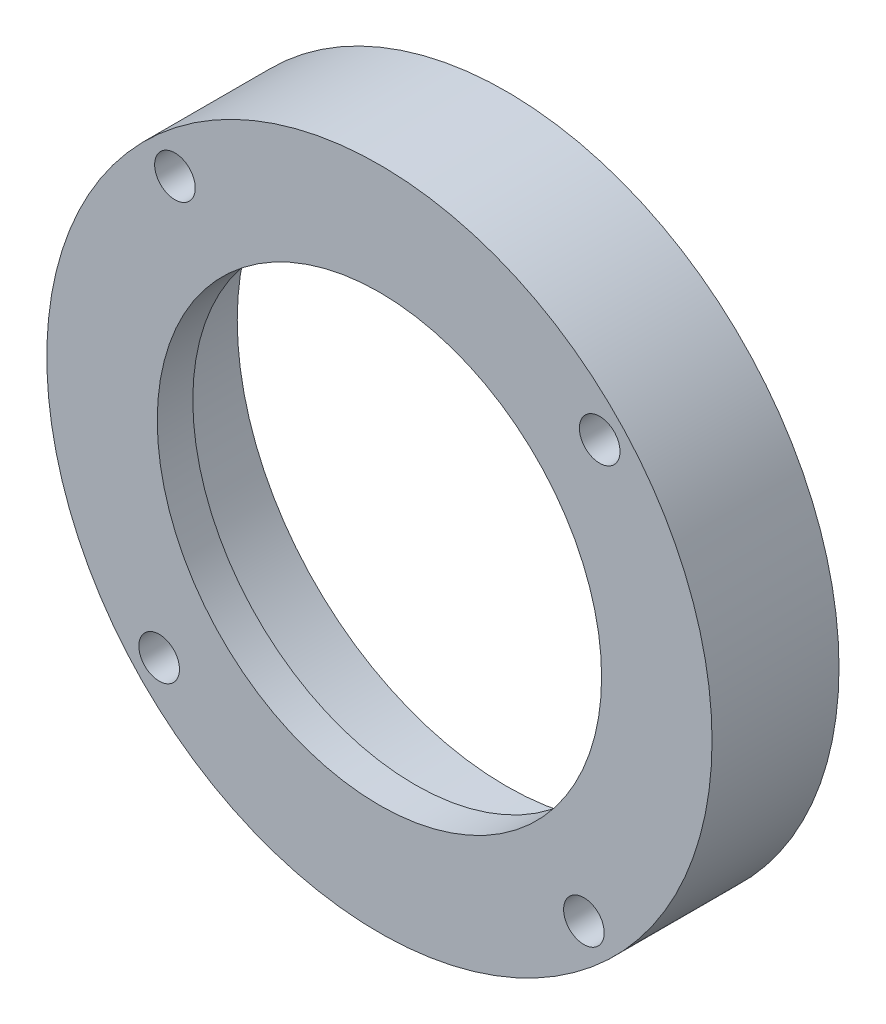
ISO-10303-21;
HEADER;
FILE_DESCRIPTION(('STEP AP214'),'2;1');
FILE_NAME('part.step','',(''),(''),'','','');
FILE_SCHEMA(('AUTOMOTIVE_DESIGN { 1 0 10303 214 1 1 1 1 }'));
ENDSEC;
DATA;
#1=APPLICATION_CONTEXT('core data for automotive mechanical design processes');
#2=APPLICATION_PROTOCOL_DEFINITION('international standard','automotive_design',2000,#1);
#3=PRODUCT_CONTEXT('',#1,'mechanical');
#4=PRODUCT('Part','Part','',(#3));
#5=PRODUCT_RELATED_PRODUCT_CATEGORY('part','',(#4));
#6=PRODUCT_DEFINITION_FORMATION('','',#4);
#7=PRODUCT_DEFINITION_CONTEXT('part definition',#1,'design');
#8=PRODUCT_DEFINITION('design','',#6,#7);
#9=PRODUCT_DEFINITION_SHAPE('','',#8);
#10=(LENGTH_UNIT() NAMED_UNIT(*) SI_UNIT(.MILLI.,.METRE.));
#11=(NAMED_UNIT(*) PLANE_ANGLE_UNIT() SI_UNIT($,.RADIAN.));
#12=(NAMED_UNIT(*) SI_UNIT($,.STERADIAN.) SOLID_ANGLE_UNIT());
#13=UNCERTAINTY_MEASURE_WITH_UNIT(LENGTH_MEASURE(1.E-05),#10,'distance_accuracy_value','');
#14=(GEOMETRIC_REPRESENTATION_CONTEXT(3) GLOBAL_UNCERTAINTY_ASSIGNED_CONTEXT((#13)) GLOBAL_UNIT_ASSIGNED_CONTEXT((#10,
#11,#12)) REPRESENTATION_CONTEXT('',''));
#15=CARTESIAN_POINT('',(0.,0.,0.));
#16=DIRECTION('',(0.,0.,1.));
#17=DIRECTION('',(1.,0.,0.));
#18=AXIS2_PLACEMENT_3D('',#15,#16,#17);
#19=CARTESIAN_POINT('',(0.,0.,10.));
#20=DIRECTION('',(0.,0.,-1.));
#21=DIRECTION('',(-1.,0.,0.));
#22=AXIS2_PLACEMENT_3D('',#19,#20,#21);
#23=CYLINDRICAL_SURFACE('',#22,17.5);
#24=CARTESIAN_POINT('',(0.,0.,10.));
#25=DIRECTION('',(0.,0.,1.));
#26=DIRECTION('',(1.,0.,0.));
#27=AXIS2_PLACEMENT_3D('',#24,#25,#26);
#28=CIRCLE('',#27,17.5);
#29=CARTESIAN_POINT('',(17.5,0.,10.));
#30=VERTEX_POINT('',#29);
#31=EDGE_CURVE('E66',#30,#30,#28,.T.);
#32=ORIENTED_EDGE('',*,*,#31,.T.);
#33=EDGE_LOOP('',(#32));
#34=FACE_BOUND('',#33,.T.);
#35=CARTESIAN_POINT('',(0.,0.,7.2));
#36=DIRECTION('',(0.,0.,-1.));
#37=DIRECTION('',(-1.,0.,0.));
#38=AXIS2_PLACEMENT_3D('',#35,#36,#37);
#39=CIRCLE('',#38,17.5);
#40=CARTESIAN_POINT('',(-17.5,0.,7.2));
#41=VERTEX_POINT('',#40);
#42=EDGE_CURVE('E34',#41,#41,#39,.T.);
#43=ORIENTED_EDGE('',*,*,#42,.T.);
#44=EDGE_LOOP('',(#43));
#45=FACE_BOUND('',#44,.T.);
#46=ADVANCED_FACE('F30',(#34,#45),#23,.F.);
#47=CARTESIAN_POINT('',(0.,0.,10.));
#48=DIRECTION('',(0.,0.,1.));
#49=DIRECTION('',(1.,0.,0.));
#50=AXIS2_PLACEMENT_3D('',#47,#48,#49);
#51=PLANE('',#50);
#52=CARTESIAN_POINT('',(-17.3491717338695,-16.1057221101862,10.));
#53=DIRECTION('',(0.,0.,1.));
#54=DIRECTION('',(1.,0.,0.));
#55=AXIS2_PLACEMENT_3D('',#52,#53,#54);
#56=CIRCLE('',#55,1.6);
#57=CARTESIAN_POINT('',(-15.7491717338695,-16.1057221101862,10.));
#58=VERTEX_POINT('',#57);
#59=EDGE_CURVE('E60',#58,#58,#56,.T.);
#60=ORIENTED_EDGE('',*,*,#59,.F.);
#61=EDGE_LOOP('',(#60));
#62=FACE_BOUND('',#61,.T.);
#63=CARTESIAN_POINT('',(16.1057221101851,-17.3491717338704,10.));
#64=DIRECTION('',(0.,0.,1.));
#65=DIRECTION('',(1.,0.,0.));
#66=AXIS2_PLACEMENT_3D('',#63,#64,#65);
#67=CIRCLE('',#66,1.6);
#68=CARTESIAN_POINT('',(17.7057221101851,-17.3491717338704,10.));
#69=VERTEX_POINT('',#68);
#70=EDGE_CURVE('E48',#69,#69,#67,.T.);
#71=ORIENTED_EDGE('',*,*,#70,.F.);
#72=EDGE_LOOP('',(#71));
#73=FACE_BOUND('',#72,.T.);
#74=CARTESIAN_POINT('',(0.,0.,10.));
#75=DIRECTION('',(0.,0.,1.));
#76=DIRECTION('',(1.,0.,0.));
#77=AXIS2_PLACEMENT_3D('',#74,#75,#76);
#78=CIRCLE('',#77,26.2000000000006);
#79=CARTESIAN_POINT('',(26.2000000000006,0.,10.));
#80=VERTEX_POINT('',#79);
#81=EDGE_CURVE('E10',#80,#80,#78,.T.);
#82=ORIENTED_EDGE('',*,*,#81,.T.);
#83=EDGE_LOOP('',(#82));
#84=FACE_BOUND('',#83,.T.);
#85=CARTESIAN_POINT('',(17.3491717338693,16.1057221101842,10.));
#86=DIRECTION('',(0.,0.,1.));
#87=DIRECTION('',(1.,0.,0.));
#88=AXIS2_PLACEMENT_3D('',#85,#86,#87);
#89=CIRCLE('',#88,1.60000000000001);
#90=CARTESIAN_POINT('',(18.9491717338693,16.1057221101842,10.));
#91=VERTEX_POINT('',#90);
#92=EDGE_CURVE('E43',#91,#91,#89,.T.);
#93=ORIENTED_EDGE('',*,*,#92,.F.);
#94=EDGE_LOOP('',(#93));
#95=FACE_BOUND('',#94,.T.);
#96=CARTESIAN_POINT('',(-16.1057221101854,17.3491717338684,10.));
#97=DIRECTION('',(0.,0.,1.));
#98=DIRECTION('',(1.,0.,0.));
#99=AXIS2_PLACEMENT_3D('',#96,#97,#98);
#100=CIRCLE('',#99,1.6);
#101=CARTESIAN_POINT('',(-14.5057221101854,17.3491717338684,10.));
#102=VERTEX_POINT('',#101);
#103=EDGE_CURVE('E54',#102,#102,#100,.T.);
#104=ORIENTED_EDGE('',*,*,#103,.F.);
#105=EDGE_LOOP('',(#104));
#106=FACE_BOUND('',#105,.T.);
#107=ORIENTED_EDGE('',*,*,#31,.F.);
#108=EDGE_LOOP('',(#107));
#109=FACE_BOUND('',#108,.T.);
#110=ADVANCED_FACE('F93',(#62,#73,#84,#95,#106,#109),#51,.T.);
#111=CARTESIAN_POINT('',(0.,0.,0.));
#112=DIRECTION('',(0.,0.,1.));
#113=DIRECTION('',(1.,0.,0.));
#114=AXIS2_PLACEMENT_3D('',#111,#112,#113);
#115=PLANE('',#114);
#116=CARTESIAN_POINT('',(0.,0.,0.));
#117=DIRECTION('',(0.,0.,-1.));
#118=DIRECTION('',(-1.,0.,0.));
#119=AXIS2_PLACEMENT_3D('',#116,#117,#118);
#120=CIRCLE('',#119,21.2);
#121=CARTESIAN_POINT('',(-21.2,0.,0.));
#122=VERTEX_POINT('',#121);
#123=EDGE_CURVE('E71',#122,#122,#120,.T.);
#124=ORIENTED_EDGE('',*,*,#123,.F.);
#125=EDGE_LOOP('',(#124));
#126=FACE_BOUND('',#125,.T.);
#127=CARTESIAN_POINT('',(0.,0.,0.));
#128=DIRECTION('',(0.,0.,1.));
#129=DIRECTION('',(1.,0.,0.));
#130=AXIS2_PLACEMENT_3D('',#127,#128,#129);
#131=CIRCLE('',#130,26.2000000000006);
#132=CARTESIAN_POINT('',(26.2000000000006,0.,0.));
#133=VERTEX_POINT('',#132);
#134=EDGE_CURVE('E38',#133,#133,#131,.T.);
#135=ORIENTED_EDGE('',*,*,#134,.F.);
#136=EDGE_LOOP('',(#135));
#137=FACE_BOUND('',#136,.T.);
#138=CARTESIAN_POINT('',(17.3491717338693,16.1057221101842,0.));
#139=DIRECTION('',(0.,0.,1.));
#140=DIRECTION('',(1.,0.,0.));
#141=AXIS2_PLACEMENT_3D('',#138,#139,#140);
#142=CIRCLE('',#141,1.60000000000001);
#143=CARTESIAN_POINT('',(18.9491717338693,16.1057221101842,0.));
#144=VERTEX_POINT('',#143);
#145=EDGE_CURVE('E45',#144,#144,#142,.T.);
#146=ORIENTED_EDGE('',*,*,#145,.T.);
#147=EDGE_LOOP('',(#146));
#148=FACE_BOUND('',#147,.T.);
#149=CARTESIAN_POINT('',(16.1057221101851,-17.3491717338704,0.));
#150=DIRECTION('',(0.,0.,1.));
#151=DIRECTION('',(1.,0.,0.));
#152=AXIS2_PLACEMENT_3D('',#149,#150,#151);
#153=CIRCLE('',#152,1.6);
#154=CARTESIAN_POINT('',(17.7057221101851,-17.3491717338704,0.));
#155=VERTEX_POINT('',#154);
#156=EDGE_CURVE('E51',#155,#155,#153,.T.);
#157=ORIENTED_EDGE('',*,*,#156,.T.);
#158=EDGE_LOOP('',(#157));
#159=FACE_BOUND('',#158,.T.);
#160=CARTESIAN_POINT('',(-16.1057221101854,17.3491717338684,0.));
#161=DIRECTION('',(0.,0.,1.));
#162=DIRECTION('',(1.,0.,0.));
#163=AXIS2_PLACEMENT_3D('',#160,#161,#162);
#164=CIRCLE('',#163,1.6);
#165=CARTESIAN_POINT('',(-14.5057221101854,17.3491717338684,0.));
#166=VERTEX_POINT('',#165);
#167=EDGE_CURVE('E57',#166,#166,#164,.T.);
#168=ORIENTED_EDGE('',*,*,#167,.T.);
#169=EDGE_LOOP('',(#168));
#170=FACE_BOUND('',#169,.T.);
#171=CARTESIAN_POINT('',(-17.3491717338695,-16.1057221101862,0.));
#172=DIRECTION('',(0.,0.,1.));
#173=DIRECTION('',(1.,0.,0.));
#174=AXIS2_PLACEMENT_3D('',#171,#172,#173);
#175=CIRCLE('',#174,1.6);
#176=CARTESIAN_POINT('',(-15.7491717338695,-16.1057221101862,0.));
#177=VERTEX_POINT('',#176);
#178=EDGE_CURVE('E63',#177,#177,#175,.T.);
#179=ORIENTED_EDGE('',*,*,#178,.T.);
#180=EDGE_LOOP('',(#179));
#181=FACE_BOUND('',#180,.T.);
#182=ADVANCED_FACE('F99',(#126,#137,#148,#159,#170,#181),#115,.F.);
#183=CARTESIAN_POINT('',(0.,0.,10.));
#184=DIRECTION('',(0.,0.,-1.));
#185=DIRECTION('',(-1.,0.,0.));
#186=AXIS2_PLACEMENT_3D('',#183,#184,#185);
#187=CYLINDRICAL_SURFACE('',#186,26.2000000000006);
#188=ORIENTED_EDGE('',*,*,#81,.F.);
#189=EDGE_LOOP('',(#188));
#190=FACE_BOUND('',#189,.T.);
#191=ORIENTED_EDGE('',*,*,#134,.T.);
#192=EDGE_LOOP('',(#191));
#193=FACE_BOUND('',#192,.T.);
#194=ADVANCED_FACE('F32',(#190,#193),#187,.T.);
#195=CARTESIAN_POINT('',(17.3491717338693,16.1057221101842,10.));
#196=DIRECTION('',(0.,0.,-1.));
#197=DIRECTION('',(-1.,0.,0.));
#198=AXIS2_PLACEMENT_3D('',#195,#196,#197);
#199=CYLINDRICAL_SURFACE('',#198,1.60000000000001);
#200=ORIENTED_EDGE('',*,*,#92,.T.);
#201=EDGE_LOOP('',(#200));
#202=FACE_BOUND('',#201,.T.);
#203=ORIENTED_EDGE('',*,*,#145,.F.);
#204=EDGE_LOOP('',(#203));
#205=FACE_BOUND('',#204,.T.);
#206=ADVANCED_FACE('F113',(#202,#205),#199,.F.);
#207=CARTESIAN_POINT('',(16.1057221101851,-17.3491717338704,10.));
#208=DIRECTION('',(0.,0.,-1.));
#209=DIRECTION('',(-1.,0.,0.));
#210=AXIS2_PLACEMENT_3D('',#207,#208,#209);
#211=CYLINDRICAL_SURFACE('',#210,1.6);
#212=ORIENTED_EDGE('',*,*,#70,.T.);
#213=EDGE_LOOP('',(#212));
#214=FACE_BOUND('',#213,.T.);
#215=ORIENTED_EDGE('',*,*,#156,.F.);
#216=EDGE_LOOP('',(#215));
#217=FACE_BOUND('',#216,.T.);
#218=ADVANCED_FACE('F109',(#214,#217),#211,.F.);
#219=CARTESIAN_POINT('',(-16.1057221101854,17.3491717338684,10.));
#220=DIRECTION('',(0.,0.,-1.));
#221=DIRECTION('',(-1.,0.,0.));
#222=AXIS2_PLACEMENT_3D('',#219,#220,#221);
#223=CYLINDRICAL_SURFACE('',#222,1.6);
#224=ORIENTED_EDGE('',*,*,#103,.T.);
#225=EDGE_LOOP('',(#224));
#226=FACE_BOUND('',#225,.T.);
#227=ORIENTED_EDGE('',*,*,#167,.F.);
#228=EDGE_LOOP('',(#227));
#229=FACE_BOUND('',#228,.T.);
#230=ADVANCED_FACE('F105',(#226,#229),#223,.F.);
#231=CARTESIAN_POINT('',(-17.3491717338695,-16.1057221101862,10.));
#232=DIRECTION('',(0.,0.,-1.));
#233=DIRECTION('',(-1.,0.,0.));
#234=AXIS2_PLACEMENT_3D('',#231,#232,#233);
#235=CYLINDRICAL_SURFACE('',#234,1.6);
#236=ORIENTED_EDGE('',*,*,#59,.T.);
#237=EDGE_LOOP('',(#236));
#238=FACE_BOUND('',#237,.T.);
#239=ORIENTED_EDGE('',*,*,#178,.F.);
#240=EDGE_LOOP('',(#239));
#241=FACE_BOUND('',#240,.T.);
#242=ADVANCED_FACE('F89',(#238,#241),#235,.F.);
#243=CARTESIAN_POINT('',(0.,0.,7.2));
#244=DIRECTION('',(0.,0.,-1.));
#245=DIRECTION('',(-1.,0.,0.));
#246=AXIS2_PLACEMENT_3D('',#243,#244,#245);
#247=CYLINDRICAL_SURFACE('',#246,21.2);
#248=CARTESIAN_POINT('',(0.,0.,7.2));
#249=DIRECTION('',(0.,0.,-1.));
#250=DIRECTION('',(-1.,0.,0.));
#251=AXIS2_PLACEMENT_3D('',#248,#249,#250);
#252=CIRCLE('',#251,21.2);
#253=CARTESIAN_POINT('',(-21.2,0.,7.2));
#254=VERTEX_POINT('',#253);
#255=EDGE_CURVE('E74',#254,#254,#252,.T.);
#256=ORIENTED_EDGE('',*,*,#255,.F.);
#257=EDGE_LOOP('',(#256));
#258=FACE_BOUND('',#257,.T.);
#259=ORIENTED_EDGE('',*,*,#123,.T.);
#260=EDGE_LOOP('',(#259));
#261=FACE_BOUND('',#260,.T.);
#262=ADVANCED_FACE('F84',(#258,#261),#247,.F.);
#263=CARTESIAN_POINT('',(0.,0.,7.2));
#264=DIRECTION('',(0.,0.,-1.));
#265=DIRECTION('',(-1.,0.,0.));
#266=AXIS2_PLACEMENT_3D('',#263,#264,#265);
#267=PLANE('',#266);
#268=ORIENTED_EDGE('',*,*,#42,.F.);
#269=EDGE_LOOP('',(#268));
#270=FACE_BOUND('',#269,.T.);
#271=ORIENTED_EDGE('',*,*,#255,.T.);
#272=EDGE_LOOP('',(#271));
#273=FACE_BOUND('',#272,.T.);
#274=ADVANCED_FACE('F82',(#270,#273),#267,.T.);
#275=CLOSED_SHELL('',(#46,#110,#182,#194,#206,#218,#230,#242,#262,#274));
#276=MANIFOLD_SOLID_BREP('B2',#275);
#277=ADVANCED_BREP_SHAPE_REPRESENTATION('',(#18,#276),#14);
#278=SHAPE_DEFINITION_REPRESENTATION(#9,#277);
ENDSEC;
END-ISO-10303-21;
